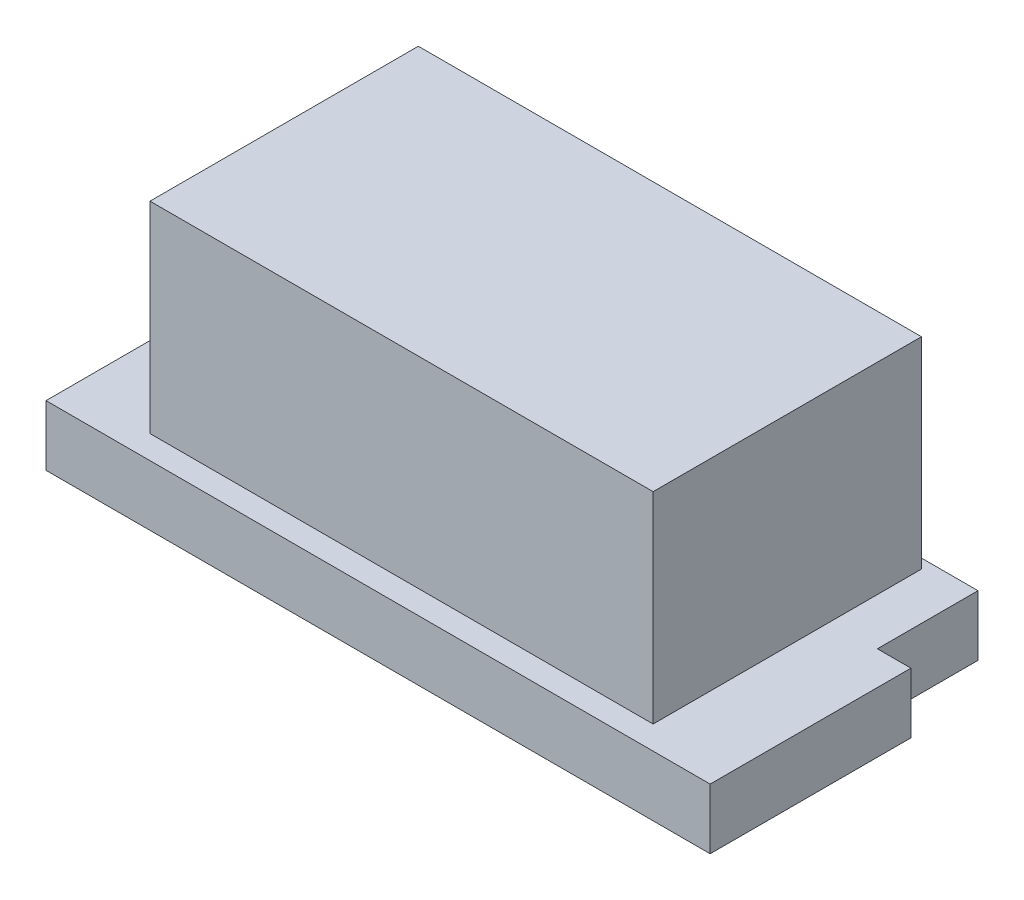
ISO-10303-21;
HEADER;
FILE_DESCRIPTION(('STEP AP214'),'2;1');
FILE_NAME('part.step','',(''),(''),'','','');
FILE_SCHEMA(('AUTOMOTIVE_DESIGN { 1 0 10303 214 1 1 1 1 }'));
ENDSEC;
DATA;
#1=APPLICATION_CONTEXT('core data for automotive mechanical design processes');
#2=APPLICATION_PROTOCOL_DEFINITION('international standard','automotive_design',2000,#1);
#3=PRODUCT_CONTEXT('',#1,'mechanical');
#4=PRODUCT('Part','Part','',(#3));
#5=PRODUCT_RELATED_PRODUCT_CATEGORY('part','',(#4));
#6=PRODUCT_DEFINITION_FORMATION('','',#4);
#7=PRODUCT_DEFINITION_CONTEXT('part definition',#1,'design');
#8=PRODUCT_DEFINITION('design','',#6,#7);
#9=PRODUCT_DEFINITION_SHAPE('','',#8);
#10=(LENGTH_UNIT() NAMED_UNIT(*) SI_UNIT(.MILLI.,.METRE.));
#11=(NAMED_UNIT(*) PLANE_ANGLE_UNIT() SI_UNIT($,.RADIAN.));
#12=(NAMED_UNIT(*) SI_UNIT($,.STERADIAN.) SOLID_ANGLE_UNIT());
#13=UNCERTAINTY_MEASURE_WITH_UNIT(LENGTH_MEASURE(1.E-05),#10,'distance_accuracy_value','');
#14=(GEOMETRIC_REPRESENTATION_CONTEXT(3) GLOBAL_UNCERTAINTY_ASSIGNED_CONTEXT((#13)) GLOBAL_UNIT_ASSIGNED_CONTEXT((#10,
#11,#12)) REPRESENTATION_CONTEXT('',''));
#15=CARTESIAN_POINT('',(0.,0.,0.));
#16=DIRECTION('',(0.,0.,1.));
#17=DIRECTION('',(1.,0.,0.));
#18=AXIS2_PLACEMENT_3D('',#15,#16,#17);
#19=CARTESIAN_POINT('',(0.,1.8,0.));
#20=DIRECTION('',(0.,1.,0.));
#21=DIRECTION('',(0.,0.,1.));
#22=AXIS2_PLACEMENT_3D('',#19,#20,#21);
#23=PLANE('',#22);
#24=DIRECTION('',(1.,0.,0.));
#25=VECTOR('',#24,1.);
#26=CARTESIAN_POINT('',(0.,1.8,-5.98537699413987));
#27=LINE('',#26,#25);
#28=CARTESIAN_POINT('',(-1.,1.8,-5.98537699413987));
#29=VERTEX_POINT('',#28);
#30=CARTESIAN_POINT('',(0.,1.8,-5.98537699413987));
#31=VERTEX_POINT('',#30);
#32=EDGE_CURVE('E136',#29,#31,#27,.T.);
#33=ORIENTED_EDGE('',*,*,#32,.F.);
#34=DIRECTION('',(0.,0.,1.));
#35=VECTOR('',#34,1.);
#36=CARTESIAN_POINT('',(-1.,1.8,-8.98537699413987));
#37=LINE('',#36,#35);
#38=CARTESIAN_POINT('',(-1.,1.8,-8.98537699413987));
#39=VERTEX_POINT('',#38);
#40=EDGE_CURVE('E125',#39,#29,#37,.T.);
#41=ORIENTED_EDGE('',*,*,#40,.F.);
#42=DIRECTION('',(1.,0.,0.));
#43=VECTOR('',#42,1.);
#44=CARTESIAN_POINT('',(-19.16,1.8,-8.98537699413987));
#45=LINE('',#44,#43);
#46=CARTESIAN_POINT('',(-18.8,1.8,-8.98537699413987));
#47=VERTEX_POINT('',#46);
#48=EDGE_CURVE('E133',#47,#39,#45,.T.);
#49=ORIENTED_EDGE('',*,*,#48,.F.);
#50=DIRECTION('',(0.,0.,-1.));
#51=VECTOR('',#50,1.);
#52=CARTESIAN_POINT('',(-18.8,1.8,-9.8));
#53=LINE('',#52,#51);
#54=CARTESIAN_POINT('',(-18.8,1.8,-6.8));
#55=VERTEX_POINT('',#54);
#56=EDGE_CURVE('E148',#55,#47,#53,.T.);
#57=ORIENTED_EDGE('',*,*,#56,.F.);
#58=DIRECTION('',(1.,0.,0.));
#59=VECTOR('',#58,1.);
#60=CARTESIAN_POINT('',(-19.8,1.8,-6.8));
#61=LINE('',#60,#59);
#62=CARTESIAN_POINT('',(-19.8,1.8,-6.8));
#63=VERTEX_POINT('',#62);
#64=EDGE_CURVE('E140',#63,#55,#61,.T.);
#65=ORIENTED_EDGE('',*,*,#64,.F.);
#66=DIRECTION('',(0.,0.,1.));
#67=VECTOR('',#66,1.);
#68=CARTESIAN_POINT('',(-19.8,1.8,0.));
#69=LINE('',#68,#67);
#70=CARTESIAN_POINT('',(-19.8,1.8,0.));
#71=VERTEX_POINT('',#70);
#72=EDGE_CURVE('E186',#63,#71,#69,.T.);
#73=ORIENTED_EDGE('',*,*,#72,.T.);
#74=DIRECTION('',(1.,0.,0.));
#75=VECTOR('',#74,1.);
#76=CARTESIAN_POINT('',(0.,1.8,0.));
#77=LINE('',#76,#75);
#78=CARTESIAN_POINT('',(0.,1.8,0.));
#79=VERTEX_POINT('',#78);
#80=EDGE_CURVE('E189',#71,#79,#77,.T.);
#81=ORIENTED_EDGE('',*,*,#80,.T.);
#82=DIRECTION('',(0.,0.,-1.));
#83=VECTOR('',#82,1.);
#84=CARTESIAN_POINT('',(0.,1.8,0.));
#85=LINE('',#84,#83);
#86=EDGE_CURVE('E184',#79,#31,#85,.T.);
#87=ORIENTED_EDGE('',*,*,#86,.T.);
#88=EDGE_LOOP('',(#33,#41,#49,#57,#65,#73,#81,#87));
#89=FACE_BOUND('',#88,.T.);
#90=DIRECTION('',(-1.,0.,0.));
#91=VECTOR('',#90,1.);
#92=CARTESIAN_POINT('',(-2.4,1.8,-8.7));
#93=LINE('',#92,#91);
#94=CARTESIAN_POINT('',(-2.4,1.8,-8.7));
#95=VERTEX_POINT('',#94);
#96=CARTESIAN_POINT('',(-17.4,1.8,-8.7));
#97=VERTEX_POINT('',#96);
#98=EDGE_CURVE('E168',#95,#97,#93,.T.);
#99=ORIENTED_EDGE('',*,*,#98,.F.);
#100=DIRECTION('',(0.,0.,-1.));
#101=VECTOR('',#100,1.);
#102=CARTESIAN_POINT('',(-2.4,1.8,-0.7));
#103=LINE('',#102,#101);
#104=CARTESIAN_POINT('',(-2.4,1.8,-0.7));
#105=VERTEX_POINT('',#104);
#106=EDGE_CURVE('E153',#105,#95,#103,.T.);
#107=ORIENTED_EDGE('',*,*,#106,.F.);
#108=DIRECTION('',(1.,0.,0.));
#109=VECTOR('',#108,1.);
#110=CARTESIAN_POINT('',(-2.4,1.8,-0.7));
#111=LINE('',#110,#109);
#112=CARTESIAN_POINT('',(-17.4,1.8,-0.699999999999998));
#113=VERTEX_POINT('',#112);
#114=EDGE_CURVE('E159',#113,#105,#111,.T.);
#115=ORIENTED_EDGE('',*,*,#114,.F.);
#116=DIRECTION('',(0.,0.,1.));
#117=VECTOR('',#116,1.);
#118=CARTESIAN_POINT('',(-17.4,1.8,-0.699999999999998));
#119=LINE('',#118,#117);
#120=EDGE_CURVE('E170',#97,#113,#119,.T.);
#121=ORIENTED_EDGE('',*,*,#120,.F.);
#122=EDGE_LOOP('',(#99,#107,#115,#121));
#123=FACE_BOUND('',#122,.T.);
#124=ADVANCED_FACE('F35',(#89,#123),#23,.T.);
#125=CARTESIAN_POINT('',(0.,1.8,0.));
#126=DIRECTION('',(-1.,0.,0.));
#127=DIRECTION('',(0.,0.,1.));
#128=AXIS2_PLACEMENT_3D('',#125,#126,#127);
#129=PLANE('',#128);
#130=DIRECTION('',(0.,0.,-1.));
#131=VECTOR('',#130,1.);
#132=CARTESIAN_POINT('',(0.,0.,0.));
#133=LINE('',#132,#131);
#134=CARTESIAN_POINT('',(0.,0.,0.));
#135=VERTEX_POINT('',#134);
#136=CARTESIAN_POINT('',(0.,0.,-5.98537699413987));
#137=VERTEX_POINT('',#136);
#138=EDGE_CURVE('E183',#135,#137,#133,.T.);
#139=ORIENTED_EDGE('',*,*,#138,.T.);
#140=DIRECTION('',(0.,1.,0.));
#141=VECTOR('',#140,1.);
#142=CARTESIAN_POINT('',(0.,-1.2,-5.98537699413987));
#143=LINE('',#142,#141);
#144=EDGE_CURVE('E142',#137,#31,#143,.T.);
#145=ORIENTED_EDGE('',*,*,#144,.T.);
#146=ORIENTED_EDGE('',*,*,#86,.F.);
#147=DIRECTION('',(0.,-1.,0.));
#148=VECTOR('',#147,1.);
#149=CARTESIAN_POINT('',(0.,1.8,0.));
#150=LINE('',#149,#148);
#151=EDGE_CURVE('E191',#79,#135,#150,.T.);
#152=ORIENTED_EDGE('',*,*,#151,.T.);
#153=EDGE_LOOP('',(#139,#145,#146,#152));
#154=FACE_BOUND('',#153,.T.);
#155=ADVANCED_FACE('F37',(#154),#129,.F.);
#156=CARTESIAN_POINT('',(-19.8,1.8,0.));
#157=DIRECTION('',(1.,0.,0.));
#158=DIRECTION('',(0.,0.,-1.));
#159=AXIS2_PLACEMENT_3D('',#156,#157,#158);
#160=PLANE('',#159);
#161=ORIENTED_EDGE('',*,*,#72,.F.);
#162=DIRECTION('',(0.,1.,0.));
#163=VECTOR('',#162,1.);
#164=CARTESIAN_POINT('',(-19.8,-1.2,-6.8));
#165=LINE('',#164,#163);
#166=CARTESIAN_POINT('',(-19.8,0.,-6.8));
#167=VERTEX_POINT('',#166);
#168=EDGE_CURVE('E150',#167,#63,#165,.T.);
#169=ORIENTED_EDGE('',*,*,#168,.F.);
#170=DIRECTION('',(0.,0.,1.));
#171=VECTOR('',#170,1.);
#172=CARTESIAN_POINT('',(-19.8,0.,0.));
#173=LINE('',#172,#171);
#174=CARTESIAN_POINT('',(-19.8,0.,0.));
#175=VERTEX_POINT('',#174);
#176=EDGE_CURVE('E194',#167,#175,#173,.T.);
#177=ORIENTED_EDGE('',*,*,#176,.T.);
#178=DIRECTION('',(0.,-1.,0.));
#179=VECTOR('',#178,1.);
#180=CARTESIAN_POINT('',(-19.8,1.8,0.));
#181=LINE('',#180,#179);
#182=EDGE_CURVE('E199',#71,#175,#181,.T.);
#183=ORIENTED_EDGE('',*,*,#182,.F.);
#184=EDGE_LOOP('',(#161,#169,#177,#183));
#185=FACE_BOUND('',#184,.T.);
#186=ADVANCED_FACE('F221',(#185),#160,.F.);
#187=CARTESIAN_POINT('',(0.,1.8,0.));
#188=DIRECTION('',(0.,0.,-1.));
#189=DIRECTION('',(-1.,0.,0.));
#190=AXIS2_PLACEMENT_3D('',#187,#188,#189);
#191=PLANE('',#190);
#192=DIRECTION('',(1.,0.,0.));
#193=VECTOR('',#192,1.);
#194=CARTESIAN_POINT('',(0.,0.,0.));
#195=LINE('',#194,#193);
#196=EDGE_CURVE('E187',#175,#135,#195,.T.);
#197=ORIENTED_EDGE('',*,*,#196,.T.);
#198=ORIENTED_EDGE('',*,*,#151,.F.);
#199=ORIENTED_EDGE('',*,*,#80,.F.);
#200=ORIENTED_EDGE('',*,*,#182,.T.);
#201=EDGE_LOOP('',(#197,#198,#199,#200));
#202=FACE_BOUND('',#201,.T.);
#203=ADVANCED_FACE('F227',(#202),#191,.F.);
#204=CARTESIAN_POINT('',(0.,0.,0.));
#205=DIRECTION('',(0.,1.,0.));
#206=DIRECTION('',(0.,0.,1.));
#207=AXIS2_PLACEMENT_3D('',#204,#205,#206);
#208=PLANE('',#207);
#209=DIRECTION('',(0.,0.,1.));
#210=VECTOR('',#209,1.);
#211=CARTESIAN_POINT('',(-1.,0.,0.));
#212=LINE('',#211,#210);
#213=CARTESIAN_POINT('',(-1.,0.,-8.98537699413987));
#214=VERTEX_POINT('',#213);
#215=CARTESIAN_POINT('',(-1.,0.,-5.98537699413987));
#216=VERTEX_POINT('',#215);
#217=EDGE_CURVE('E50',#214,#216,#212,.T.);
#218=ORIENTED_EDGE('',*,*,#217,.T.);
#219=DIRECTION('',(1.,0.,0.));
#220=VECTOR('',#219,1.);
#221=CARTESIAN_POINT('',(0.,0.,-5.98537699413987));
#222=LINE('',#221,#220);
#223=EDGE_CURVE('E11',#216,#137,#222,.T.);
#224=ORIENTED_EDGE('',*,*,#223,.T.);
#225=ORIENTED_EDGE('',*,*,#138,.F.);
#226=ORIENTED_EDGE('',*,*,#196,.F.);
#227=ORIENTED_EDGE('',*,*,#176,.F.);
#228=DIRECTION('',(1.,0.,0.));
#229=VECTOR('',#228,1.);
#230=CARTESIAN_POINT('',(0.,0.,-6.8));
#231=LINE('',#230,#229);
#232=CARTESIAN_POINT('',(-18.8,0.,-6.8));
#233=VERTEX_POINT('',#232);
#234=EDGE_CURVE('E202',#167,#233,#231,.T.);
#235=ORIENTED_EDGE('',*,*,#234,.T.);
#236=DIRECTION('',(0.,0.,-1.));
#237=VECTOR('',#236,1.);
#238=CARTESIAN_POINT('',(-18.8,0.,0.));
#239=LINE('',#238,#237);
#240=CARTESIAN_POINT('',(-18.8,0.,-8.98537699413987));
#241=VERTEX_POINT('',#240);
#242=EDGE_CURVE('E205',#233,#241,#239,.T.);
#243=ORIENTED_EDGE('',*,*,#242,.T.);
#244=DIRECTION('',(1.,0.,0.));
#245=VECTOR('',#244,1.);
#246=CARTESIAN_POINT('',(0.,0.,-8.98537699413987));
#247=LINE('',#246,#245);
#248=EDGE_CURVE('E57',#241,#214,#247,.T.);
#249=ORIENTED_EDGE('',*,*,#248,.T.);
#250=EDGE_LOOP('',(#218,#224,#225,#226,#227,#235,#243,#249));
#251=FACE_BOUND('',#250,.T.);
#252=ADVANCED_FACE('F212',(#251),#208,.F.);
#253=CARTESIAN_POINT('',(-2.4,7.8,-0.7));
#254=DIRECTION('',(-1.,0.,0.));
#255=DIRECTION('',(0.,0.,1.));
#256=AXIS2_PLACEMENT_3D('',#253,#254,#255);
#257=PLANE('',#256);
#258=ORIENTED_EDGE('',*,*,#106,.T.);
#259=DIRECTION('',(0.,-1.,0.));
#260=VECTOR('',#259,1.);
#261=CARTESIAN_POINT('',(-2.4,7.8,-8.7));
#262=LINE('',#261,#260);
#263=CARTESIAN_POINT('',(-2.4,7.8,-8.7));
#264=VERTEX_POINT('',#263);
#265=EDGE_CURVE('E181',#264,#95,#262,.T.);
#266=ORIENTED_EDGE('',*,*,#265,.F.);
#267=DIRECTION('',(0.,0.,-1.));
#268=VECTOR('',#267,1.);
#269=CARTESIAN_POINT('',(-2.4,7.8,-0.7));
#270=LINE('',#269,#268);
#271=CARTESIAN_POINT('',(-2.4,7.8,-0.7));
#272=VERTEX_POINT('',#271);
#273=EDGE_CURVE('E155',#272,#264,#270,.T.);
#274=ORIENTED_EDGE('',*,*,#273,.F.);
#275=DIRECTION('',(0.,-1.,0.));
#276=VECTOR('',#275,1.);
#277=CARTESIAN_POINT('',(-2.4,7.8,-0.7));
#278=LINE('',#277,#276);
#279=EDGE_CURVE('E165',#272,#105,#278,.T.);
#280=ORIENTED_EDGE('',*,*,#279,.T.);
#281=EDGE_LOOP('',(#258,#266,#274,#280));
#282=FACE_BOUND('',#281,.T.);
#283=ADVANCED_FACE('F251',(#282),#257,.F.);
#284=CARTESIAN_POINT('',(-2.4,7.8,-8.7));
#285=DIRECTION('',(0.,0.,1.));
#286=DIRECTION('',(1.,0.,0.));
#287=AXIS2_PLACEMENT_3D('',#284,#285,#286);
#288=PLANE('',#287);
#289=ORIENTED_EDGE('',*,*,#98,.T.);
#290=DIRECTION('',(0.,-1.,0.));
#291=VECTOR('',#290,1.);
#292=CARTESIAN_POINT('',(-17.4,7.8,-8.7));
#293=LINE('',#292,#291);
#294=CARTESIAN_POINT('',(-17.4,7.8,-8.7));
#295=VERTEX_POINT('',#294);
#296=EDGE_CURVE('E178',#295,#97,#293,.T.);
#297=ORIENTED_EDGE('',*,*,#296,.F.);
#298=DIRECTION('',(-1.,0.,0.));
#299=VECTOR('',#298,1.);
#300=CARTESIAN_POINT('',(-2.4,7.8,-8.7));
#301=LINE('',#300,#299);
#302=EDGE_CURVE('E158',#264,#295,#301,.T.);
#303=ORIENTED_EDGE('',*,*,#302,.F.);
#304=ORIENTED_EDGE('',*,*,#265,.T.);
#305=EDGE_LOOP('',(#289,#297,#303,#304));
#306=FACE_BOUND('',#305,.T.);
#307=ADVANCED_FACE('F278',(#306),#288,.F.);
#308=CARTESIAN_POINT('',(-17.4,7.8,-0.699999999999998));
#309=DIRECTION('',(1.,0.,0.));
#310=DIRECTION('',(0.,0.,-1.));
#311=AXIS2_PLACEMENT_3D('',#308,#309,#310);
#312=PLANE('',#311);
#313=ORIENTED_EDGE('',*,*,#120,.T.);
#314=DIRECTION('',(0.,-1.,0.));
#315=VECTOR('',#314,1.);
#316=CARTESIAN_POINT('',(-17.4,7.8,-0.699999999999998));
#317=LINE('',#316,#315);
#318=CARTESIAN_POINT('',(-17.4,7.8,-0.699999999999998));
#319=VERTEX_POINT('',#318);
#320=EDGE_CURVE('E176',#319,#113,#317,.T.);
#321=ORIENTED_EDGE('',*,*,#320,.F.);
#322=DIRECTION('',(0.,0.,1.));
#323=VECTOR('',#322,1.);
#324=CARTESIAN_POINT('',(-17.4,7.8,-0.699999999999998));
#325=LINE('',#324,#323);
#326=EDGE_CURVE('E161',#295,#319,#325,.T.);
#327=ORIENTED_EDGE('',*,*,#326,.F.);
#328=ORIENTED_EDGE('',*,*,#296,.T.);
#329=EDGE_LOOP('',(#313,#321,#327,#328));
#330=FACE_BOUND('',#329,.T.);
#331=ADVANCED_FACE('F285',(#330),#312,.F.);
#332=CARTESIAN_POINT('',(-2.4,7.8,-0.7));
#333=DIRECTION('',(0.,0.,-1.));
#334=DIRECTION('',(-1.,0.,0.));
#335=AXIS2_PLACEMENT_3D('',#332,#333,#334);
#336=PLANE('',#335);
#337=ORIENTED_EDGE('',*,*,#114,.T.);
#338=ORIENTED_EDGE('',*,*,#279,.F.);
#339=DIRECTION('',(1.,0.,0.));
#340=VECTOR('',#339,1.);
#341=CARTESIAN_POINT('',(-2.4,7.8,-0.7));
#342=LINE('',#341,#340);
#343=EDGE_CURVE('E163',#319,#272,#342,.T.);
#344=ORIENTED_EDGE('',*,*,#343,.F.);
#345=ORIENTED_EDGE('',*,*,#320,.T.);
#346=EDGE_LOOP('',(#337,#338,#344,#345));
#347=FACE_BOUND('',#346,.T.);
#348=ADVANCED_FACE('F292',(#347),#336,.F.);
#349=CARTESIAN_POINT('',(0.,7.8,0.));
#350=DIRECTION('',(0.,1.,0.));
#351=DIRECTION('',(0.,0.,1.));
#352=AXIS2_PLACEMENT_3D('',#349,#350,#351);
#353=PLANE('',#352);
#354=ORIENTED_EDGE('',*,*,#273,.T.);
#355=ORIENTED_EDGE('',*,*,#302,.T.);
#356=ORIENTED_EDGE('',*,*,#326,.T.);
#357=ORIENTED_EDGE('',*,*,#343,.T.);
#358=EDGE_LOOP('',(#354,#355,#356,#357));
#359=FACE_BOUND('',#358,.T.);
#360=ADVANCED_FACE('F300',(#359),#353,.T.);
#361=CARTESIAN_POINT('',(-18.8,-1.2,-9.8));
#362=DIRECTION('',(1.,0.,0.));
#363=DIRECTION('',(0.,0.,-1.));
#364=AXIS2_PLACEMENT_3D('',#361,#362,#363);
#365=PLANE('',#364);
#366=ORIENTED_EDGE('',*,*,#56,.T.);
#367=DIRECTION('',(0.,-1.,0.));
#368=VECTOR('',#367,1.);
#369=CARTESIAN_POINT('',(-18.8,-1.2,-8.98537699413987));
#370=LINE('',#369,#368);
#371=EDGE_CURVE('E128',#47,#241,#370,.T.);
#372=ORIENTED_EDGE('',*,*,#371,.T.);
#373=ORIENTED_EDGE('',*,*,#242,.F.);
#374=DIRECTION('',(0.,1.,0.));
#375=VECTOR('',#374,1.);
#376=CARTESIAN_POINT('',(-18.8,-1.2,-6.8));
#377=LINE('',#376,#375);
#378=EDGE_CURVE('E151',#233,#55,#377,.T.);
#379=ORIENTED_EDGE('',*,*,#378,.T.);
#380=EDGE_LOOP('',(#366,#372,#373,#379));
#381=FACE_BOUND('',#380,.T.);
#382=ADVANCED_FACE('F210',(#381),#365,.F.);
#383=CARTESIAN_POINT('',(-19.8,-1.2,-6.8));
#384=DIRECTION('',(0.,0.,1.));
#385=DIRECTION('',(1.,0.,0.));
#386=AXIS2_PLACEMENT_3D('',#383,#384,#385);
#387=PLANE('',#386);
#388=ORIENTED_EDGE('',*,*,#168,.T.);
#389=ORIENTED_EDGE('',*,*,#64,.T.);
#390=ORIENTED_EDGE('',*,*,#378,.F.);
#391=ORIENTED_EDGE('',*,*,#234,.F.);
#392=EDGE_LOOP('',(#388,#389,#390,#391));
#393=FACE_BOUND('',#392,.T.);
#394=ADVANCED_FACE('F217',(#393),#387,.F.);
#395=CARTESIAN_POINT('',(-19.16,-1.2,-8.98537699413987));
#396=DIRECTION('',(0.,0.,1.));
#397=DIRECTION('',(1.,0.,0.));
#398=AXIS2_PLACEMENT_3D('',#395,#396,#397);
#399=PLANE('',#398);
#400=ORIENTED_EDGE('',*,*,#48,.T.);
#401=DIRECTION('',(0.,-1.,0.));
#402=VECTOR('',#401,1.);
#403=CARTESIAN_POINT('',(-1.,-1.2,-8.98537699413987));
#404=LINE('',#403,#402);
#405=EDGE_CURVE('E43',#39,#214,#404,.T.);
#406=ORIENTED_EDGE('',*,*,#405,.T.);
#407=ORIENTED_EDGE('',*,*,#248,.F.);
#408=ORIENTED_EDGE('',*,*,#371,.F.);
#409=EDGE_LOOP('',(#400,#406,#407,#408));
#410=FACE_BOUND('',#409,.T.);
#411=ADVANCED_FACE('F138',(#410),#399,.F.);
#412=CARTESIAN_POINT('',(0.,-1.2,-5.98537699413987));
#413=DIRECTION('',(0.,0.,1.));
#414=DIRECTION('',(1.,0.,0.));
#415=AXIS2_PLACEMENT_3D('',#412,#413,#414);
#416=PLANE('',#415);
#417=DIRECTION('',(0.,1.,0.));
#418=VECTOR('',#417,1.);
#419=CARTESIAN_POINT('',(-1.,-1.2,-5.98537699413987));
#420=LINE('',#419,#418);
#421=EDGE_CURVE('E232',#216,#29,#420,.T.);
#422=ORIENTED_EDGE('',*,*,#421,.T.);
#423=ORIENTED_EDGE('',*,*,#32,.T.);
#424=ORIENTED_EDGE('',*,*,#144,.F.);
#425=ORIENTED_EDGE('',*,*,#223,.F.);
#426=EDGE_LOOP('',(#422,#423,#424,#425));
#427=FACE_BOUND('',#426,.T.);
#428=ADVANCED_FACE('F235',(#427),#416,.F.);
#429=CARTESIAN_POINT('',(-1.,-1.2,-8.98537699413987));
#430=DIRECTION('',(-1.,0.,0.));
#431=DIRECTION('',(0.,0.,1.));
#432=AXIS2_PLACEMENT_3D('',#429,#430,#431);
#433=PLANE('',#432);
#434=ORIENTED_EDGE('',*,*,#405,.F.);
#435=ORIENTED_EDGE('',*,*,#40,.T.);
#436=ORIENTED_EDGE('',*,*,#421,.F.);
#437=ORIENTED_EDGE('',*,*,#217,.F.);
#438=EDGE_LOOP('',(#434,#435,#436,#437));
#439=FACE_BOUND('',#438,.T.);
#440=ADVANCED_FACE('F124',(#439),#433,.F.);
#441=CLOSED_SHELL('',(#124,#155,#186,#203,#252,#283,#307,#331,#348,#360,#382,#394,#411,#428,#440));
#442=MANIFOLD_SOLID_BREP('B2',#441);
#443=ADVANCED_BREP_SHAPE_REPRESENTATION('',(#18,#442),#14);
#444=SHAPE_DEFINITION_REPRESENTATION(#9,#443);
ENDSEC;
END-ISO-10303-21;
